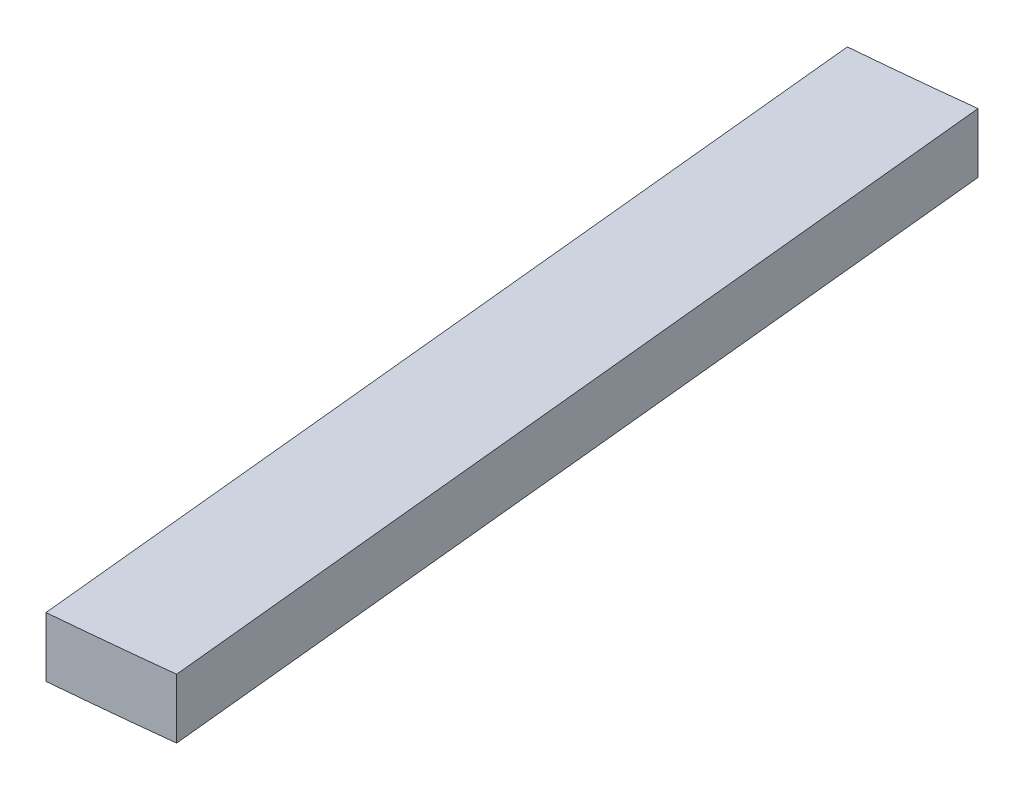
ISO-10303-21;
HEADER;
FILE_DESCRIPTION(('STEP AP214'),'2;1');
FILE_NAME('part.step','',(''),(''),'','','');
FILE_SCHEMA(('AUTOMOTIVE_DESIGN { 1 0 10303 214 1 1 1 1 }'));
ENDSEC;
DATA;
#1=APPLICATION_CONTEXT('core data for automotive mechanical design processes');
#2=APPLICATION_PROTOCOL_DEFINITION('international standard','automotive_design',2000,#1);
#3=PRODUCT_CONTEXT('',#1,'mechanical');
#4=PRODUCT('Part','Part','',(#3));
#5=PRODUCT_RELATED_PRODUCT_CATEGORY('part','',(#4));
#6=PRODUCT_DEFINITION_FORMATION('','',#4);
#7=PRODUCT_DEFINITION_CONTEXT('part definition',#1,'design');
#8=PRODUCT_DEFINITION('design','',#6,#7);
#9=PRODUCT_DEFINITION_SHAPE('','',#8);
#10=(LENGTH_UNIT() NAMED_UNIT(*) SI_UNIT(.MILLI.,.METRE.));
#11=(NAMED_UNIT(*) PLANE_ANGLE_UNIT() SI_UNIT($,.RADIAN.));
#12=(NAMED_UNIT(*) SI_UNIT($,.STERADIAN.) SOLID_ANGLE_UNIT());
#13=UNCERTAINTY_MEASURE_WITH_UNIT(LENGTH_MEASURE(1.E-05),#10,'distance_accuracy_value','');
#14=(GEOMETRIC_REPRESENTATION_CONTEXT(3) GLOBAL_UNCERTAINTY_ASSIGNED_CONTEXT((#13)) GLOBAL_UNIT_ASSIGNED_CONTEXT((#10,
#11,#12)) REPRESENTATION_CONTEXT('',''));
#15=CARTESIAN_POINT('',(0.,0.,0.));
#16=DIRECTION('',(0.,0.,1.));
#17=DIRECTION('',(1.,0.,0.));
#18=AXIS2_PLACEMENT_3D('',#15,#16,#17);
#19=CARTESIAN_POINT('',(0.,7.62,0.));
#20=DIRECTION('',(0.,1.,0.));
#21=DIRECTION('',(0.,0.,1.));
#22=AXIS2_PLACEMENT_3D('',#19,#20,#21);
#23=PLANE('',#22);
#24=DIRECTION('',(-0.0996422744451563,0.,-0.995023324924294));
#25=VECTOR('',#24,1.);
#26=CARTESIAN_POINT('',(1.54035035829521,7.62,17.9309890807704));
#27=LINE('',#26,#25);
#28=CARTESIAN_POINT('',(1.92001863171602,7.62,21.7223395882838));
#29=VERTEX_POINT('',#28);
#30=CARTESIAN_POINT('',(1.54035035829521,7.62,17.9309890807704));
#31=VERTEX_POINT('',#30);
#32=EDGE_CURVE('E59',#29,#31,#27,.T.);
#33=ORIENTED_EDGE('',*,*,#32,.T.);
#34=CARTESIAN_POINT('',(0.,7.62,0.));
#35=DIRECTION('',(0.,1.,0.));
#36=DIRECTION('',(0.,0.,1.));
#37=AXIS2_PLACEMENT_3D('',#34,#35,#36);
#38=CIRCLE('',#37,17.9970288837077);
#39=CARTESIAN_POINT('',(2.04582220735675,7.62,17.8803708053523));
#40=VERTEX_POINT('',#39);
#41=EDGE_CURVE('E81',#31,#40,#38,.T.);
#42=ORIENTED_EDGE('',*,*,#41,.T.);
#43=DIRECTION('',(0.0996422744451562,0.,0.995023324924294));
#44=VECTOR('',#43,1.);
#45=CARTESIAN_POINT('',(2.04582220735675,7.62,17.8803708053523));
#46=LINE('',#45,#44);
#47=CARTESIAN_POINT('',(2.42549048077755,7.62,21.6717213128657));
#48=VERTEX_POINT('',#47);
#49=EDGE_CURVE('E60',#40,#48,#46,.T.);
#50=ORIENTED_EDGE('',*,*,#49,.T.);
#51=CARTESIAN_POINT('',(0.,7.62,0.));
#52=DIRECTION('',(0.,1.,0.));
#53=DIRECTION('',(0.,0.,1.));
#54=AXIS2_PLACEMENT_3D('',#51,#52,#53);
#55=CIRCLE('',#54,21.8070288837077);
#56=EDGE_CURVE('E20',#29,#48,#55,.T.);
#57=ORIENTED_EDGE('',*,*,#56,.F.);
#58=EDGE_LOOP('',(#33,#42,#50,#57));
#59=FACE_BOUND('',#58,.T.);
#60=ADVANCED_FACE('F17',(#59),#23,.F.);
#61=CARTESIAN_POINT('',(0.,7.874,0.));
#62=DIRECTION('',(0.,1.,0.));
#63=DIRECTION('',(0.,0.,1.));
#64=AXIS2_PLACEMENT_3D('',#61,#62,#63);
#65=CYLINDRICAL_SURFACE('',#64,21.8070288837077);
#66=CARTESIAN_POINT('',(0.,7.874,0.));
#67=DIRECTION('',(0.,1.,0.));
#68=DIRECTION('',(0.,0.,1.));
#69=AXIS2_PLACEMENT_3D('',#66,#67,#68);
#70=CIRCLE('',#69,21.8070288837077);
#71=CARTESIAN_POINT('',(1.92001863171601,7.874,21.7223395882838));
#72=VERTEX_POINT('',#71);
#73=CARTESIAN_POINT('',(2.42549048077755,7.874,21.6717213128657));
#74=VERTEX_POINT('',#73);
#75=EDGE_CURVE('E68',#72,#74,#70,.T.);
#76=ORIENTED_EDGE('',*,*,#75,.F.);
#77=DIRECTION('',(0.,1.,0.));
#78=VECTOR('',#77,1.);
#79=CARTESIAN_POINT('',(1.92001863171601,7.874,21.7223395882838));
#80=LINE('',#79,#78);
#81=EDGE_CURVE('E65',#72,#29,#80,.F.);
#82=ORIENTED_EDGE('',*,*,#81,.T.);
#83=ORIENTED_EDGE('',*,*,#56,.T.);
#84=DIRECTION('',(0.,1.,0.));
#85=VECTOR('',#84,1.);
#86=CARTESIAN_POINT('',(2.42549048077755,7.874,21.6717213128657));
#87=LINE('',#86,#85);
#88=EDGE_CURVE('E63',#48,#74,#87,.T.);
#89=ORIENTED_EDGE('',*,*,#88,.T.);
#90=EDGE_LOOP('',(#76,#82,#83,#89));
#91=FACE_BOUND('',#90,.T.);
#92=ADVANCED_FACE('F66',(#91),#65,.T.);
#93=CARTESIAN_POINT('',(2.04582220735675,7.874,17.8803708053523));
#94=DIRECTION('',(-0.995023324924294,0.,0.0996422744451562));
#95=DIRECTION('',(0.0996422744451562,0.,0.995023324924294));
#96=AXIS2_PLACEMENT_3D('',#93,#94,#95);
#97=PLANE('',#96);
#98=DIRECTION('',(0.,1.,0.));
#99=VECTOR('',#98,1.);
#100=CARTESIAN_POINT('',(2.04582220735675,7.874,17.8803708053523));
#101=LINE('',#100,#99);
#102=CARTESIAN_POINT('',(2.04582220735675,7.874,17.8803708053523));
#103=VERTEX_POINT('',#102);
#104=EDGE_CURVE('E79',#40,#103,#101,.T.);
#105=ORIENTED_EDGE('',*,*,#104,.T.);
#106=DIRECTION('',(-0.0996422744451557,0.,-0.995023324924293));
#107=VECTOR('',#106,1.);
#108=CARTESIAN_POINT('',(2.42549048077755,7.874,21.6717213128657));
#109=LINE('',#108,#107);
#110=EDGE_CURVE('E73',#74,#103,#109,.T.);
#111=ORIENTED_EDGE('',*,*,#110,.F.);
#112=ORIENTED_EDGE('',*,*,#88,.F.);
#113=ORIENTED_EDGE('',*,*,#49,.F.);
#114=EDGE_LOOP('',(#105,#111,#112,#113));
#115=FACE_BOUND('',#114,.T.);
#116=ADVANCED_FACE('F90',(#115),#97,.F.);
#117=CARTESIAN_POINT('',(0.,7.874,0.));
#118=DIRECTION('',(0.,1.,0.));
#119=DIRECTION('',(0.,0.,1.));
#120=AXIS2_PLACEMENT_3D('',#117,#118,#119);
#121=CYLINDRICAL_SURFACE('',#120,17.9970288837077);
#122=DIRECTION('',(0.,1.,0.));
#123=VECTOR('',#122,1.);
#124=CARTESIAN_POINT('',(1.54035035829521,7.874,17.9309890807704));
#125=LINE('',#124,#123);
#126=CARTESIAN_POINT('',(1.54035035829521,7.874,17.9309890807704));
#127=VERTEX_POINT('',#126);
#128=EDGE_CURVE('E35',#31,#127,#125,.T.);
#129=ORIENTED_EDGE('',*,*,#128,.T.);
#130=CARTESIAN_POINT('',(0.,7.874,0.));
#131=DIRECTION('',(0.,1.,0.));
#132=DIRECTION('',(0.,0.,1.));
#133=AXIS2_PLACEMENT_3D('',#130,#131,#132);
#134=CIRCLE('',#133,17.9970288837077);
#135=EDGE_CURVE('E26',#103,#127,#134,.F.);
#136=ORIENTED_EDGE('',*,*,#135,.F.);
#137=ORIENTED_EDGE('',*,*,#104,.F.);
#138=ORIENTED_EDGE('',*,*,#41,.F.);
#139=EDGE_LOOP('',(#129,#136,#137,#138));
#140=FACE_BOUND('',#139,.T.);
#141=ADVANCED_FACE('F92',(#140),#121,.F.);
#142=CARTESIAN_POINT('',(1.54035035829521,7.874,17.9309890807704));
#143=DIRECTION('',(0.995023324924294,0.,-0.0996422744451563));
#144=DIRECTION('',(-0.0996422744451563,0.,-0.995023324924294));
#145=AXIS2_PLACEMENT_3D('',#142,#143,#144);
#146=PLANE('',#145);
#147=ORIENTED_EDGE('',*,*,#81,.F.);
#148=DIRECTION('',(0.0996422744451555,0.,0.995023324924293));
#149=VECTOR('',#148,1.);
#150=CARTESIAN_POINT('',(1.54035035829521,7.874,17.9309890807704));
#151=LINE('',#150,#149);
#152=EDGE_CURVE('E11',#127,#72,#151,.T.);
#153=ORIENTED_EDGE('',*,*,#152,.F.);
#154=ORIENTED_EDGE('',*,*,#128,.F.);
#155=ORIENTED_EDGE('',*,*,#32,.F.);
#156=EDGE_LOOP('',(#147,#153,#154,#155));
#157=FACE_BOUND('',#156,.T.);
#158=ADVANCED_FACE('F71',(#157),#146,.F.);
#159=CARTESIAN_POINT('',(0.,7.874,0.));
#160=DIRECTION('',(0.,1.,0.));
#161=DIRECTION('',(0.,0.,1.));
#162=AXIS2_PLACEMENT_3D('',#159,#160,#161);
#163=PLANE('',#162);
#164=ORIENTED_EDGE('',*,*,#135,.T.);
#165=ORIENTED_EDGE('',*,*,#152,.T.);
#166=ORIENTED_EDGE('',*,*,#75,.T.);
#167=ORIENTED_EDGE('',*,*,#110,.T.);
#168=EDGE_LOOP('',(#164,#165,#166,#167));
#169=FACE_BOUND('',#168,.T.);
#170=ADVANCED_FACE('F89',(#169),#163,.T.);
#171=CLOSED_SHELL('',(#60,#92,#116,#141,#158,#170));
#172=MANIFOLD_SOLID_BREP('B1',#171);
#173=ADVANCED_BREP_SHAPE_REPRESENTATION('',(#18,#172),#14);
#174=SHAPE_DEFINITION_REPRESENTATION(#9,#173);
ENDSEC;
END-ISO-10303-21;
